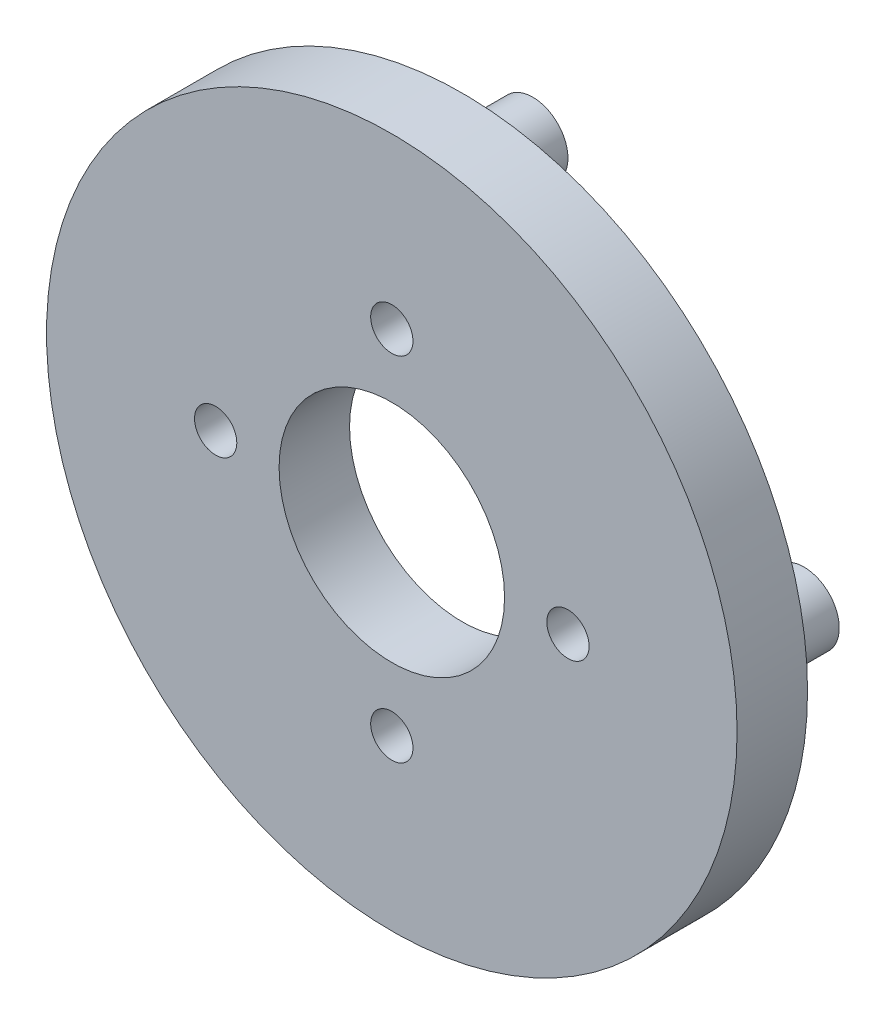
ISO-10303-21;
HEADER;
FILE_DESCRIPTION(('STEP AP214'),'2;1');
FILE_NAME('part.step','',(''),(''),'','','');
FILE_SCHEMA(('AUTOMOTIVE_DESIGN { 1 0 10303 214 1 1 1 1 }'));
ENDSEC;
DATA;
#1=APPLICATION_CONTEXT('core data for automotive mechanical design processes');
#2=APPLICATION_PROTOCOL_DEFINITION('international standard','automotive_design',2000,#1);
#3=PRODUCT_CONTEXT('',#1,'mechanical');
#4=PRODUCT('Part','Part','',(#3));
#5=PRODUCT_RELATED_PRODUCT_CATEGORY('part','',(#4));
#6=PRODUCT_DEFINITION_FORMATION('','',#4);
#7=PRODUCT_DEFINITION_CONTEXT('part definition',#1,'design');
#8=PRODUCT_DEFINITION('design','',#6,#7);
#9=PRODUCT_DEFINITION_SHAPE('','',#8);
#10=(LENGTH_UNIT() NAMED_UNIT(*) SI_UNIT(.MILLI.,.METRE.));
#11=(NAMED_UNIT(*) PLANE_ANGLE_UNIT() SI_UNIT($,.RADIAN.));
#12=(NAMED_UNIT(*) SI_UNIT($,.STERADIAN.) SOLID_ANGLE_UNIT());
#13=UNCERTAINTY_MEASURE_WITH_UNIT(LENGTH_MEASURE(1.E-05),#10,'distance_accuracy_value','');
#14=(GEOMETRIC_REPRESENTATION_CONTEXT(3) GLOBAL_UNCERTAINTY_ASSIGNED_CONTEXT((#13)) GLOBAL_UNIT_ASSIGNED_CONTEXT((#10,
#11,#12)) REPRESENTATION_CONTEXT('',''));
#15=CARTESIAN_POINT('',(0.,0.,0.));
#16=DIRECTION('',(0.,0.,1.));
#17=DIRECTION('',(1.,0.,0.));
#18=AXIS2_PLACEMENT_3D('',#15,#16,#17);
#19=CARTESIAN_POINT('',(0.,0.,5.));
#20=DIRECTION('',(0.,0.,1.));
#21=DIRECTION('',(1.,0.,0.));
#22=AXIS2_PLACEMENT_3D('',#19,#20,#21);
#23=PLANE('',#22);
#24=CARTESIAN_POINT('',(0.,0.,5.));
#25=DIRECTION('',(0.,0.,1.));
#26=DIRECTION('',(1.,0.,0.));
#27=AXIS2_PLACEMENT_3D('',#24,#25,#26);
#28=CIRCLE('',#27,8.);
#29=CARTESIAN_POINT('',(8.,0.,5.));
#30=VERTEX_POINT('',#29);
#31=EDGE_CURVE('E68',#30,#30,#28,.T.);
#32=ORIENTED_EDGE('',*,*,#31,.F.);
#33=EDGE_LOOP('',(#32));
#34=FACE_BOUND('',#33,.T.);
#35=CARTESIAN_POINT('',(7.05950310263298E-13,-12.5,5.));
#36=DIRECTION('',(0.,0.,1.));
#37=DIRECTION('',(1.,0.,0.));
#38=AXIS2_PLACEMENT_3D('',#35,#36,#37);
#39=CIRCLE('',#38,1.50000000000076);
#40=CARTESIAN_POINT('',(1.50000000000146,-12.5,5.));
#41=VERTEX_POINT('',#40);
#42=EDGE_CURVE('E127',#41,#41,#39,.T.);
#43=ORIENTED_EDGE('',*,*,#42,.F.);
#44=EDGE_LOOP('',(#43));
#45=FACE_BOUND('',#44,.T.);
#46=CARTESIAN_POINT('',(0.,12.5,5.));
#47=DIRECTION('',(0.,0.,1.));
#48=DIRECTION('',(1.,0.,0.));
#49=AXIS2_PLACEMENT_3D('',#46,#47,#48);
#50=CIRCLE('',#49,1.5);
#51=CARTESIAN_POINT('',(1.5,12.5,5.));
#52=VERTEX_POINT('',#51);
#53=EDGE_CURVE('E48',#52,#52,#50,.T.);
#54=ORIENTED_EDGE('',*,*,#53,.F.);
#55=EDGE_LOOP('',(#54));
#56=FACE_BOUND('',#55,.T.);
#57=CARTESIAN_POINT('',(0.,0.,5.));
#58=DIRECTION('',(0.,0.,1.));
#59=DIRECTION('',(1.,0.,0.));
#60=AXIS2_PLACEMENT_3D('',#57,#58,#59);
#61=CIRCLE('',#60,24.5);
#62=CARTESIAN_POINT('',(24.5,0.,5.));
#63=VERTEX_POINT('',#62);
#64=EDGE_CURVE('E10',#63,#63,#61,.T.);
#65=ORIENTED_EDGE('',*,*,#64,.T.);
#66=EDGE_LOOP('',(#65));
#67=FACE_BOUND('',#66,.T.);
#68=CARTESIAN_POINT('',(12.5,0.,5.));
#69=DIRECTION('',(0.,0.,1.));
#70=DIRECTION('',(1.,0.,0.));
#71=AXIS2_PLACEMENT_3D('',#68,#69,#70);
#72=CIRCLE('',#71,1.5);
#73=CARTESIAN_POINT('',(14.,0.,5.));
#74=VERTEX_POINT('',#73);
#75=EDGE_CURVE('E129',#74,#74,#72,.T.);
#76=ORIENTED_EDGE('',*,*,#75,.F.);
#77=EDGE_LOOP('',(#76));
#78=FACE_BOUND('',#77,.T.);
#79=CARTESIAN_POINT('',(-12.4999999999996,-3.54505963630583E-13,5.));
#80=DIRECTION('',(0.,0.,1.));
#81=DIRECTION('',(1.,0.,0.));
#82=AXIS2_PLACEMENT_3D('',#79,#80,#81);
#83=CIRCLE('',#82,1.50000000000057);
#84=CARTESIAN_POINT('',(-10.9999999999991,-3.54505963630583E-13,5.));
#85=VERTEX_POINT('',#84);
#86=EDGE_CURVE('E122',#85,#85,#83,.T.);
#87=ORIENTED_EDGE('',*,*,#86,.F.);
#88=EDGE_LOOP('',(#87));
#89=FACE_BOUND('',#88,.T.);
#90=ADVANCED_FACE('F35',(#34,#45,#56,#67,#78,#89),#23,.T.);
#91=CARTESIAN_POINT('',(0.,0.,0.));
#92=DIRECTION('',(0.,0.,1.));
#93=DIRECTION('',(1.,0.,0.));
#94=AXIS2_PLACEMENT_3D('',#91,#92,#93);
#95=PLANE('',#94);
#96=CARTESIAN_POINT('',(0.,12.5,0.));
#97=DIRECTION('',(0.,0.,1.));
#98=DIRECTION('',(1.,0.,0.));
#99=AXIS2_PLACEMENT_3D('',#96,#97,#98);
#100=CIRCLE('',#99,2.5);
#101=CARTESIAN_POINT('',(2.5,12.5,0.));
#102=VERTEX_POINT('',#101);
#103=EDGE_CURVE('E179',#102,#102,#100,.T.);
#104=ORIENTED_EDGE('',*,*,#103,.T.);
#105=EDGE_LOOP('',(#104));
#106=FACE_BOUND('',#105,.T.);
#107=CARTESIAN_POINT('',(12.5000000000004,3.52975155131649E-13,0.));
#108=DIRECTION('',(0.,0.,1.));
#109=DIRECTION('',(1.,0.,0.));
#110=AXIS2_PLACEMENT_3D('',#107,#108,#109);
#111=CIRCLE('',#110,2.50000000000028);
#112=CARTESIAN_POINT('',(15.0000000000006,3.52975155131649E-13,0.));
#113=VERTEX_POINT('',#112);
#114=EDGE_CURVE('E183',#113,#113,#111,.T.);
#115=ORIENTED_EDGE('',*,*,#114,.T.);
#116=EDGE_LOOP('',(#115));
#117=FACE_BOUND('',#116,.T.);
#118=CARTESIAN_POINT('',(7.05950310263298E-13,-12.5,0.));
#119=DIRECTION('',(0.,0.,1.));
#120=DIRECTION('',(1.,0.,0.));
#121=AXIS2_PLACEMENT_3D('',#118,#119,#120);
#122=CIRCLE('',#121,2.50000000000076);
#123=CARTESIAN_POINT('',(2.50000000000147,-12.5,0.));
#124=VERTEX_POINT('',#123);
#125=EDGE_CURVE('E187',#124,#124,#122,.T.);
#126=ORIENTED_EDGE('',*,*,#125,.T.);
#127=EDGE_LOOP('',(#126));
#128=FACE_BOUND('',#127,.T.);
#129=CARTESIAN_POINT('',(-12.4999999999996,-3.54505963630583E-13,0.));
#130=DIRECTION('',(0.,0.,1.));
#131=DIRECTION('',(1.,0.,0.));
#132=AXIS2_PLACEMENT_3D('',#129,#130,#131);
#133=CIRCLE('',#132,2.50000000000057);
#134=CARTESIAN_POINT('',(-9.99999999999908,-3.54505963630583E-13,0.));
#135=VERTEX_POINT('',#134);
#136=EDGE_CURVE('E190',#135,#135,#133,.T.);
#137=ORIENTED_EDGE('',*,*,#136,.T.);
#138=EDGE_LOOP('',(#137));
#139=FACE_BOUND('',#138,.T.);
#140=CARTESIAN_POINT('',(0.,0.,0.));
#141=DIRECTION('',(0.,0.,1.));
#142=DIRECTION('',(1.,0.,0.));
#143=AXIS2_PLACEMENT_3D('',#140,#141,#142);
#144=CIRCLE('',#143,8.);
#145=CARTESIAN_POINT('',(8.,0.,0.));
#146=VERTEX_POINT('',#145);
#147=EDGE_CURVE('E64',#146,#146,#144,.T.);
#148=ORIENTED_EDGE('',*,*,#147,.T.);
#149=EDGE_LOOP('',(#148));
#150=FACE_BOUND('',#149,.T.);
#151=CARTESIAN_POINT('',(-19.2499999999995,-5.45939183991098E-13,0.));
#152=DIRECTION('',(0.,0.,1.));
#153=DIRECTION('',(1.,0.,0.));
#154=AXIS2_PLACEMENT_3D('',#151,#152,#153);
#155=CIRCLE('',#154,2.50000000000087);
#156=CARTESIAN_POINT('',(-16.7499999999986,-5.45939183991098E-13,0.));
#157=VERTEX_POINT('',#156);
#158=EDGE_CURVE('E80',#157,#157,#155,.T.);
#159=ORIENTED_EDGE('',*,*,#158,.T.);
#160=EDGE_LOOP('',(#159));
#161=FACE_BOUND('',#160,.T.);
#162=CARTESIAN_POINT('',(1.08716347780548E-12,-19.25,0.));
#163=DIRECTION('',(0.,0.,1.));
#164=DIRECTION('',(1.,0.,0.));
#165=AXIS2_PLACEMENT_3D('',#162,#163,#164);
#166=CIRCLE('',#165,2.50000000000117);
#167=CARTESIAN_POINT('',(2.50000000000226,-19.25,0.));
#168=VERTEX_POINT('',#167);
#169=EDGE_CURVE('E104',#168,#168,#166,.T.);
#170=ORIENTED_EDGE('',*,*,#169,.T.);
#171=EDGE_LOOP('',(#170));
#172=FACE_BOUND('',#171,.T.);
#173=CARTESIAN_POINT('',(19.2500000000005,5.43581738902739E-13,0.));
#174=DIRECTION('',(0.,0.,1.));
#175=DIRECTION('',(1.,0.,0.));
#176=AXIS2_PLACEMENT_3D('',#173,#174,#175);
#177=CIRCLE('',#176,2.50000000000043);
#178=CARTESIAN_POINT('',(21.750000000001,5.43581738902739E-13,0.));
#179=VERTEX_POINT('',#178);
#180=EDGE_CURVE('E110',#179,#179,#177,.T.);
#181=ORIENTED_EDGE('',*,*,#180,.T.);
#182=EDGE_LOOP('',(#181));
#183=FACE_BOUND('',#182,.T.);
#184=CARTESIAN_POINT('',(0.,19.25,0.));
#185=DIRECTION('',(0.,0.,1.));
#186=DIRECTION('',(1.,0.,0.));
#187=AXIS2_PLACEMENT_3D('',#184,#185,#186);
#188=CIRCLE('',#187,2.5);
#189=CARTESIAN_POINT('',(2.5,19.25,0.));
#190=VERTEX_POINT('',#189);
#191=EDGE_CURVE('E116',#190,#190,#188,.T.);
#192=ORIENTED_EDGE('',*,*,#191,.T.);
#193=EDGE_LOOP('',(#192));
#194=FACE_BOUND('',#193,.T.);
#195=CARTESIAN_POINT('',(0.,0.,0.));
#196=DIRECTION('',(0.,0.,1.));
#197=DIRECTION('',(1.,0.,0.));
#198=AXIS2_PLACEMENT_3D('',#195,#196,#197);
#199=CIRCLE('',#198,24.5);
#200=CARTESIAN_POINT('',(24.5,0.,0.));
#201=VERTEX_POINT('',#200);
#202=EDGE_CURVE('E43',#201,#201,#199,.T.);
#203=ORIENTED_EDGE('',*,*,#202,.F.);
#204=EDGE_LOOP('',(#203));
#205=FACE_BOUND('',#204,.T.);
#206=ADVANCED_FACE('F139',(#106,#117,#128,#139,#150,#161,#172,#183,#194,#205),#95,.F.);
#207=CARTESIAN_POINT('',(0.,0.,5.));
#208=DIRECTION('',(0.,0.,-1.));
#209=DIRECTION('',(-1.,0.,0.));
#210=AXIS2_PLACEMENT_3D('',#207,#208,#209);
#211=CYLINDRICAL_SURFACE('',#210,24.5);
#212=ORIENTED_EDGE('',*,*,#64,.F.);
#213=EDGE_LOOP('',(#212));
#214=FACE_BOUND('',#213,.T.);
#215=ORIENTED_EDGE('',*,*,#202,.T.);
#216=EDGE_LOOP('',(#215));
#217=FACE_BOUND('',#216,.T.);
#218=ADVANCED_FACE('F37',(#214,#217),#211,.T.);
#219=CARTESIAN_POINT('',(0.,12.5,5.));
#220=DIRECTION('',(0.,0.,-1.));
#221=DIRECTION('',(-1.,0.,0.));
#222=AXIS2_PLACEMENT_3D('',#219,#220,#221);
#223=CYLINDRICAL_SURFACE('',#222,1.5);
#224=CARTESIAN_POINT('',(0.,12.5,2.));
#225=DIRECTION('',(0.,0.,1.));
#226=DIRECTION('',(1.,0.,0.));
#227=AXIS2_PLACEMENT_3D('',#224,#225,#226);
#228=CIRCLE('',#227,1.5);
#229=CARTESIAN_POINT('',(1.5,12.5,2.));
#230=VERTEX_POINT('',#229);
#231=EDGE_CURVE('E39',#230,#230,#228,.T.);
#232=ORIENTED_EDGE('',*,*,#231,.F.);
#233=EDGE_LOOP('',(#232));
#234=FACE_BOUND('',#233,.T.);
#235=ORIENTED_EDGE('',*,*,#53,.T.);
#236=EDGE_LOOP('',(#235));
#237=FACE_BOUND('',#236,.T.);
#238=ADVANCED_FACE('F136',(#234,#237),#223,.F.);
#239=CARTESIAN_POINT('',(12.5,0.,5.));
#240=DIRECTION('',(0.,0.,-1.));
#241=DIRECTION('',(-1.,0.,0.));
#242=AXIS2_PLACEMENT_3D('',#239,#240,#241);
#243=CYLINDRICAL_SURFACE('',#242,1.5);
#244=CARTESIAN_POINT('',(12.5,0.,2.));
#245=DIRECTION('',(0.,0.,1.));
#246=DIRECTION('',(1.,0.,0.));
#247=AXIS2_PLACEMENT_3D('',#244,#245,#246);
#248=CIRCLE('',#247,1.5);
#249=CARTESIAN_POINT('',(14.,0.,2.));
#250=VERTEX_POINT('',#249);
#251=EDGE_CURVE('E59',#250,#250,#248,.T.);
#252=ORIENTED_EDGE('',*,*,#251,.F.);
#253=EDGE_LOOP('',(#252));
#254=FACE_BOUND('',#253,.T.);
#255=ORIENTED_EDGE('',*,*,#75,.T.);
#256=EDGE_LOOP('',(#255));
#257=FACE_BOUND('',#256,.T.);
#258=ADVANCED_FACE('F159',(#254,#257),#243,.F.);
#259=CARTESIAN_POINT('',(7.05950310263298E-13,-12.5,5.));
#260=DIRECTION('',(0.,0.,-1.));
#261=DIRECTION('',(-1.,0.,0.));
#262=AXIS2_PLACEMENT_3D('',#259,#260,#261);
#263=CYLINDRICAL_SURFACE('',#262,1.50000000000076);
#264=CARTESIAN_POINT('',(7.05950310263298E-13,-12.5,2.));
#265=DIRECTION('',(0.,0.,1.));
#266=DIRECTION('',(1.,0.,0.));
#267=AXIS2_PLACEMENT_3D('',#264,#265,#266);
#268=CIRCLE('',#267,1.50000000000076);
#269=CARTESIAN_POINT('',(1.50000000000146,-12.5,2.));
#270=VERTEX_POINT('',#269);
#271=EDGE_CURVE('E56',#270,#270,#268,.T.);
#272=ORIENTED_EDGE('',*,*,#271,.F.);
#273=EDGE_LOOP('',(#272));
#274=FACE_BOUND('',#273,.T.);
#275=ORIENTED_EDGE('',*,*,#42,.T.);
#276=EDGE_LOOP('',(#275));
#277=FACE_BOUND('',#276,.T.);
#278=ADVANCED_FACE('F149',(#274,#277),#263,.F.);
#279=CARTESIAN_POINT('',(-12.4999999999996,-3.54505963630583E-13,5.));
#280=DIRECTION('',(0.,0.,-1.));
#281=DIRECTION('',(-1.,0.,0.));
#282=AXIS2_PLACEMENT_3D('',#279,#280,#281);
#283=CYLINDRICAL_SURFACE('',#282,1.50000000000057);
#284=CARTESIAN_POINT('',(-12.4999999999996,-3.54505963630583E-13,2.));
#285=DIRECTION('',(0.,0.,1.));
#286=DIRECTION('',(1.,0.,0.));
#287=AXIS2_PLACEMENT_3D('',#284,#285,#286);
#288=CIRCLE('',#287,1.50000000000057);
#289=CARTESIAN_POINT('',(-10.9999999999991,-3.54505963630583E-13,2.));
#290=VERTEX_POINT('',#289);
#291=EDGE_CURVE('E53',#290,#290,#288,.T.);
#292=ORIENTED_EDGE('',*,*,#291,.F.);
#293=EDGE_LOOP('',(#292));
#294=FACE_BOUND('',#293,.T.);
#295=ORIENTED_EDGE('',*,*,#86,.T.);
#296=EDGE_LOOP('',(#295));
#297=FACE_BOUND('',#296,.T.);
#298=ADVANCED_FACE('F146',(#294,#297),#283,.F.);
#299=CARTESIAN_POINT('',(0.,19.25,-5.));
#300=DIRECTION('',(0.,0.,1.));
#301=DIRECTION('',(1.,0.,0.));
#302=AXIS2_PLACEMENT_3D('',#299,#300,#301);
#303=CYLINDRICAL_SURFACE('',#302,2.5);
#304=CARTESIAN_POINT('',(0.,19.25,-5.));
#305=DIRECTION('',(0.,0.,1.));
#306=DIRECTION('',(1.,0.,0.));
#307=AXIS2_PLACEMENT_3D('',#304,#305,#306);
#308=CIRCLE('',#307,2.5);
#309=CARTESIAN_POINT('',(2.5,19.25,-5.));
#310=VERTEX_POINT('',#309);
#311=EDGE_CURVE('E119',#310,#310,#308,.T.);
#312=ORIENTED_EDGE('',*,*,#311,.T.);
#313=EDGE_LOOP('',(#312));
#314=FACE_BOUND('',#313,.T.);
#315=ORIENTED_EDGE('',*,*,#191,.F.);
#316=EDGE_LOOP('',(#315));
#317=FACE_BOUND('',#316,.T.);
#318=ADVANCED_FACE('F148',(#314,#317),#303,.T.);
#319=CARTESIAN_POINT('',(0.,19.25,-5.));
#320=DIRECTION('',(0.,0.,1.));
#321=DIRECTION('',(1.,0.,0.));
#322=AXIS2_PLACEMENT_3D('',#319,#320,#321);
#323=PLANE('',#322);
#324=CARTESIAN_POINT('',(0.,19.25,-5.));
#325=DIRECTION('',(0.,0.,1.));
#326=DIRECTION('',(1.,0.,0.));
#327=AXIS2_PLACEMENT_3D('',#324,#325,#326);
#328=CIRCLE('',#327,1.25);
#329=CARTESIAN_POINT('',(1.25,19.25,-5.));
#330=VERTEX_POINT('',#329);
#331=EDGE_CURVE('E77',#330,#330,#328,.T.);
#332=ORIENTED_EDGE('',*,*,#331,.T.);
#333=EDGE_LOOP('',(#332));
#334=FACE_BOUND('',#333,.T.);
#335=ORIENTED_EDGE('',*,*,#311,.F.);
#336=EDGE_LOOP('',(#335));
#337=FACE_BOUND('',#336,.T.);
#338=ADVANCED_FACE('F156',(#334,#337),#323,.F.);
#339=CARTESIAN_POINT('',(19.2500000000005,5.43581738902739E-13,-5.));
#340=DIRECTION('',(0.,0.,1.));
#341=DIRECTION('',(1.,0.,0.));
#342=AXIS2_PLACEMENT_3D('',#339,#340,#341);
#343=CYLINDRICAL_SURFACE('',#342,2.50000000000043);
#344=CARTESIAN_POINT('',(19.2500000000005,5.43581738902739E-13,-5.));
#345=DIRECTION('',(0.,0.,1.));
#346=DIRECTION('',(1.,0.,0.));
#347=AXIS2_PLACEMENT_3D('',#344,#345,#346);
#348=CIRCLE('',#347,2.50000000000043);
#349=CARTESIAN_POINT('',(21.750000000001,5.43581738902739E-13,-5.));
#350=VERTEX_POINT('',#349);
#351=EDGE_CURVE('E113',#350,#350,#348,.T.);
#352=ORIENTED_EDGE('',*,*,#351,.T.);
#353=EDGE_LOOP('',(#352));
#354=FACE_BOUND('',#353,.T.);
#355=ORIENTED_EDGE('',*,*,#180,.F.);
#356=EDGE_LOOP('',(#355));
#357=FACE_BOUND('',#356,.T.);
#358=ADVANCED_FACE('F204',(#354,#357),#343,.T.);
#359=CARTESIAN_POINT('',(19.2500000000005,5.43581738902739E-13,-5.));
#360=DIRECTION('',(0.,0.,1.));
#361=DIRECTION('',(1.,0.,0.));
#362=AXIS2_PLACEMENT_3D('',#359,#360,#361);
#363=PLANE('',#362);
#364=CARTESIAN_POINT('',(19.2500000000005,5.43581738902739E-13,-5.));
#365=DIRECTION('',(0.,0.,1.));
#366=DIRECTION('',(1.,0.,0.));
#367=AXIS2_PLACEMENT_3D('',#364,#365,#366);
#368=CIRCLE('',#367,1.25000000000043);
#369=CARTESIAN_POINT('',(20.500000000001,5.43581738902739E-13,-5.));
#370=VERTEX_POINT('',#369);
#371=EDGE_CURVE('E84',#370,#370,#368,.T.);
#372=ORIENTED_EDGE('',*,*,#371,.T.);
#373=EDGE_LOOP('',(#372));
#374=FACE_BOUND('',#373,.T.);
#375=ORIENTED_EDGE('',*,*,#351,.F.);
#376=EDGE_LOOP('',(#375));
#377=FACE_BOUND('',#376,.T.);
#378=ADVANCED_FACE('F206',(#374,#377),#363,.F.);
#379=CARTESIAN_POINT('',(1.08716347780548E-12,-19.25,-5.));
#380=DIRECTION('',(0.,0.,1.));
#381=DIRECTION('',(1.,0.,0.));
#382=AXIS2_PLACEMENT_3D('',#379,#380,#381);
#383=CYLINDRICAL_SURFACE('',#382,2.50000000000117);
#384=CARTESIAN_POINT('',(1.08716347780548E-12,-19.25,-5.));
#385=DIRECTION('',(0.,0.,1.));
#386=DIRECTION('',(1.,0.,0.));
#387=AXIS2_PLACEMENT_3D('',#384,#385,#386);
#388=CIRCLE('',#387,2.50000000000117);
#389=CARTESIAN_POINT('',(2.50000000000226,-19.25,-5.));
#390=VERTEX_POINT('',#389);
#391=EDGE_CURVE('E107',#390,#390,#388,.T.);
#392=ORIENTED_EDGE('',*,*,#391,.T.);
#393=EDGE_LOOP('',(#392));
#394=FACE_BOUND('',#393,.T.);
#395=ORIENTED_EDGE('',*,*,#169,.F.);
#396=EDGE_LOOP('',(#395));
#397=FACE_BOUND('',#396,.T.);
#398=ADVANCED_FACE('F213',(#394,#397),#383,.T.);
#399=CARTESIAN_POINT('',(1.08716347780548E-12,-19.25,-5.));
#400=DIRECTION('',(0.,0.,1.));
#401=DIRECTION('',(1.,0.,0.));
#402=AXIS2_PLACEMENT_3D('',#399,#400,#401);
#403=PLANE('',#402);
#404=CARTESIAN_POINT('',(1.08716347780548E-12,-19.25,-5.));
#405=DIRECTION('',(0.,0.,1.));
#406=DIRECTION('',(1.,0.,0.));
#407=AXIS2_PLACEMENT_3D('',#404,#405,#406);
#408=CIRCLE('',#407,1.25000000000117);
#409=CARTESIAN_POINT('',(1.25000000000226,-19.25,-5.));
#410=VERTEX_POINT('',#409);
#411=EDGE_CURVE('E90',#410,#410,#408,.T.);
#412=ORIENTED_EDGE('',*,*,#411,.T.);
#413=EDGE_LOOP('',(#412));
#414=FACE_BOUND('',#413,.T.);
#415=ORIENTED_EDGE('',*,*,#391,.F.);
#416=EDGE_LOOP('',(#415));
#417=FACE_BOUND('',#416,.T.);
#418=ADVANCED_FACE('F220',(#414,#417),#403,.F.);
#419=CARTESIAN_POINT('',(-19.2499999999995,-5.45939183991098E-13,-5.));
#420=DIRECTION('',(0.,0.,1.));
#421=DIRECTION('',(1.,0.,0.));
#422=AXIS2_PLACEMENT_3D('',#419,#420,#421);
#423=CYLINDRICAL_SURFACE('',#422,2.50000000000087);
#424=CARTESIAN_POINT('',(-19.2499999999995,-5.45939183991098E-13,-5.));
#425=DIRECTION('',(0.,0.,1.));
#426=DIRECTION('',(1.,0.,0.));
#427=AXIS2_PLACEMENT_3D('',#424,#425,#426);
#428=CIRCLE('',#427,2.50000000000087);
#429=CARTESIAN_POINT('',(-16.7499999999986,-5.45939183991098E-13,-5.));
#430=VERTEX_POINT('',#429);
#431=EDGE_CURVE('E101',#430,#430,#428,.T.);
#432=ORIENTED_EDGE('',*,*,#431,.T.);
#433=EDGE_LOOP('',(#432));
#434=FACE_BOUND('',#433,.T.);
#435=ORIENTED_EDGE('',*,*,#158,.F.);
#436=EDGE_LOOP('',(#435));
#437=FACE_BOUND('',#436,.T.);
#438=ADVANCED_FACE('F224',(#434,#437),#423,.T.);
#439=CARTESIAN_POINT('',(-19.2499999999995,-5.45939183991098E-13,-5.));
#440=DIRECTION('',(0.,0.,1.));
#441=DIRECTION('',(1.,0.,0.));
#442=AXIS2_PLACEMENT_3D('',#439,#440,#441);
#443=PLANE('',#442);
#444=CARTESIAN_POINT('',(-19.2499999999995,-5.45939183991098E-13,-5.));
#445=DIRECTION('',(0.,0.,1.));
#446=DIRECTION('',(1.,0.,0.));
#447=AXIS2_PLACEMENT_3D('',#444,#445,#446);
#448=CIRCLE('',#447,1.25000000000087);
#449=CARTESIAN_POINT('',(-17.9999999999986,-5.45939183991098E-13,-5.));
#450=VERTEX_POINT('',#449);
#451=EDGE_CURVE('E96',#450,#450,#448,.T.);
#452=ORIENTED_EDGE('',*,*,#451,.T.);
#453=EDGE_LOOP('',(#452));
#454=FACE_BOUND('',#453,.T.);
#455=ORIENTED_EDGE('',*,*,#431,.F.);
#456=EDGE_LOOP('',(#455));
#457=FACE_BOUND('',#456,.T.);
#458=ADVANCED_FACE('F228',(#454,#457),#443,.F.);
#459=CARTESIAN_POINT('',(-19.2499999999995,-5.45939183991098E-13,-5.));
#460=DIRECTION('',(0.,0.,1.));
#461=DIRECTION('',(1.,0.,0.));
#462=AXIS2_PLACEMENT_3D('',#459,#460,#461);
#463=CYLINDRICAL_SURFACE('',#462,1.25000000000087);
#464=ORIENTED_EDGE('',*,*,#451,.F.);
#465=EDGE_LOOP('',(#464));
#466=FACE_BOUND('',#465,.T.);
#467=CARTESIAN_POINT('',(-19.2499999999995,-5.45939183991098E-13,0.));
#468=DIRECTION('',(0.,0.,1.));
#469=DIRECTION('',(1.,0.,0.));
#470=AXIS2_PLACEMENT_3D('',#467,#468,#469);
#471=CIRCLE('',#470,1.25000000000087);
#472=CARTESIAN_POINT('',(-17.9999999999986,-5.45939183991098E-13,0.));
#473=VERTEX_POINT('',#472);
#474=EDGE_CURVE('E73',#473,#473,#471,.T.);
#475=ORIENTED_EDGE('',*,*,#474,.T.);
#476=EDGE_LOOP('',(#475));
#477=FACE_BOUND('',#476,.T.);
#478=ADVANCED_FACE('F232',(#466,#477),#463,.F.);
#479=CARTESIAN_POINT('',(-19.2499999999995,-5.45939183991098E-13,0.));
#480=DIRECTION('',(0.,0.,1.));
#481=DIRECTION('',(1.,0.,0.));
#482=AXIS2_PLACEMENT_3D('',#479,#480,#481);
#483=PLANE('',#482);
#484=ORIENTED_EDGE('',*,*,#474,.F.);
#485=EDGE_LOOP('',(#484));
#486=FACE_BOUND('',#485,.T.);
#487=ADVANCED_FACE('F236',(#486),#483,.F.);
#488=CARTESIAN_POINT('',(1.08716347780548E-12,-19.25,-5.));
#489=DIRECTION('',(0.,0.,1.));
#490=DIRECTION('',(1.,0.,0.));
#491=AXIS2_PLACEMENT_3D('',#488,#489,#490);
#492=CYLINDRICAL_SURFACE('',#491,1.25000000000117);
#493=ORIENTED_EDGE('',*,*,#411,.F.);
#494=EDGE_LOOP('',(#493));
#495=FACE_BOUND('',#494,.T.);
#496=CARTESIAN_POINT('',(1.08716347780548E-12,-19.25,0.));
#497=DIRECTION('',(0.,0.,1.));
#498=DIRECTION('',(1.,0.,0.));
#499=AXIS2_PLACEMENT_3D('',#496,#497,#498);
#500=CIRCLE('',#499,1.25000000000117);
#501=CARTESIAN_POINT('',(1.25000000000226,-19.25,0.));
#502=VERTEX_POINT('',#501);
#503=EDGE_CURVE('E93',#502,#502,#500,.T.);
#504=ORIENTED_EDGE('',*,*,#503,.T.);
#505=EDGE_LOOP('',(#504));
#506=FACE_BOUND('',#505,.T.);
#507=ADVANCED_FACE('F240',(#495,#506),#492,.F.);
#508=CARTESIAN_POINT('',(1.08716347780548E-12,-19.25,0.));
#509=DIRECTION('',(0.,0.,1.));
#510=DIRECTION('',(1.,0.,0.));
#511=AXIS2_PLACEMENT_3D('',#508,#509,#510);
#512=PLANE('',#511);
#513=ORIENTED_EDGE('',*,*,#503,.F.);
#514=EDGE_LOOP('',(#513));
#515=FACE_BOUND('',#514,.T.);
#516=ADVANCED_FACE('F244',(#515),#512,.F.);
#517=CARTESIAN_POINT('',(19.2500000000005,5.43581738902739E-13,-5.));
#518=DIRECTION('',(0.,0.,1.));
#519=DIRECTION('',(1.,0.,0.));
#520=AXIS2_PLACEMENT_3D('',#517,#518,#519);
#521=CYLINDRICAL_SURFACE('',#520,1.25000000000043);
#522=ORIENTED_EDGE('',*,*,#371,.F.);
#523=EDGE_LOOP('',(#522));
#524=FACE_BOUND('',#523,.T.);
#525=CARTESIAN_POINT('',(19.2500000000005,5.43581738902739E-13,0.));
#526=DIRECTION('',(0.,0.,1.));
#527=DIRECTION('',(1.,0.,0.));
#528=AXIS2_PLACEMENT_3D('',#525,#526,#527);
#529=CIRCLE('',#528,1.25000000000043);
#530=CARTESIAN_POINT('',(20.500000000001,5.43581738902739E-13,0.));
#531=VERTEX_POINT('',#530);
#532=EDGE_CURVE('E87',#531,#531,#529,.T.);
#533=ORIENTED_EDGE('',*,*,#532,.T.);
#534=EDGE_LOOP('',(#533));
#535=FACE_BOUND('',#534,.T.);
#536=ADVANCED_FACE('F248',(#524,#535),#521,.F.);
#537=CARTESIAN_POINT('',(19.2500000000005,5.43581738902739E-13,0.));
#538=DIRECTION('',(0.,0.,1.));
#539=DIRECTION('',(1.,0.,0.));
#540=AXIS2_PLACEMENT_3D('',#537,#538,#539);
#541=PLANE('',#540);
#542=ORIENTED_EDGE('',*,*,#532,.F.);
#543=EDGE_LOOP('',(#542));
#544=FACE_BOUND('',#543,.T.);
#545=ADVANCED_FACE('F252',(#544),#541,.F.);
#546=CARTESIAN_POINT('',(0.,19.25,-5.));
#547=DIRECTION('',(0.,0.,1.));
#548=DIRECTION('',(1.,0.,0.));
#549=AXIS2_PLACEMENT_3D('',#546,#547,#548);
#550=CYLINDRICAL_SURFACE('',#549,1.25);
#551=ORIENTED_EDGE('',*,*,#331,.F.);
#552=EDGE_LOOP('',(#551));
#553=FACE_BOUND('',#552,.T.);
#554=CARTESIAN_POINT('',(0.,19.25,0.));
#555=DIRECTION('',(0.,0.,1.));
#556=DIRECTION('',(1.,0.,0.));
#557=AXIS2_PLACEMENT_3D('',#554,#555,#556);
#558=CIRCLE('',#557,1.25);
#559=CARTESIAN_POINT('',(1.25,19.25,0.));
#560=VERTEX_POINT('',#559);
#561=EDGE_CURVE('E81',#560,#560,#558,.T.);
#562=ORIENTED_EDGE('',*,*,#561,.T.);
#563=EDGE_LOOP('',(#562));
#564=FACE_BOUND('',#563,.T.);
#565=ADVANCED_FACE('F256',(#553,#564),#550,.F.);
#566=CARTESIAN_POINT('',(0.,19.25,0.));
#567=DIRECTION('',(0.,0.,1.));
#568=DIRECTION('',(1.,0.,0.));
#569=AXIS2_PLACEMENT_3D('',#566,#567,#568);
#570=PLANE('',#569);
#571=ORIENTED_EDGE('',*,*,#561,.F.);
#572=EDGE_LOOP('',(#571));
#573=FACE_BOUND('',#572,.T.);
#574=ADVANCED_FACE('F260',(#573),#570,.F.);
#575=CARTESIAN_POINT('',(0.,0.,5.));
#576=DIRECTION('',(0.,0.,-1.));
#577=DIRECTION('',(-1.,0.,0.));
#578=AXIS2_PLACEMENT_3D('',#575,#576,#577);
#579=CYLINDRICAL_SURFACE('',#578,8.);
#580=ORIENTED_EDGE('',*,*,#31,.T.);
#581=EDGE_LOOP('',(#580));
#582=FACE_BOUND('',#581,.T.);
#583=ORIENTED_EDGE('',*,*,#147,.F.);
#584=EDGE_LOOP('',(#583));
#585=FACE_BOUND('',#584,.T.);
#586=ADVANCED_FACE('F264',(#582,#585),#579,.F.);
#587=CARTESIAN_POINT('',(-12.4999999999996,-3.54505963630583E-13,2.));
#588=DIRECTION('',(0.,0.,-1.));
#589=DIRECTION('',(-1.,0.,0.));
#590=AXIS2_PLACEMENT_3D('',#587,#588,#589);
#591=CYLINDRICAL_SURFACE('',#590,2.50000000000057);
#592=CARTESIAN_POINT('',(-12.4999999999996,-3.54505963630583E-13,2.));
#593=DIRECTION('',(0.,0.,1.));
#594=DIRECTION('',(1.,0.,0.));
#595=AXIS2_PLACEMENT_3D('',#592,#593,#594);
#596=CIRCLE('',#595,2.50000000000057);
#597=CARTESIAN_POINT('',(-9.99999999999908,-3.54505963630583E-13,2.));
#598=VERTEX_POINT('',#597);
#599=EDGE_CURVE('E314',#598,#598,#596,.T.);
#600=ORIENTED_EDGE('',*,*,#599,.T.);
#601=EDGE_LOOP('',(#600));
#602=FACE_BOUND('',#601,.T.);
#603=ORIENTED_EDGE('',*,*,#136,.F.);
#604=EDGE_LOOP('',(#603));
#605=FACE_BOUND('',#604,.T.);
#606=ADVANCED_FACE('F268',(#602,#605),#591,.F.);
#607=CARTESIAN_POINT('',(-12.4999999999996,-3.54505963630583E-13,2.));
#608=DIRECTION('',(0.,0.,1.));
#609=DIRECTION('',(1.,0.,0.));
#610=AXIS2_PLACEMENT_3D('',#607,#608,#609);
#611=PLANE('',#610);
#612=ORIENTED_EDGE('',*,*,#291,.T.);
#613=EDGE_LOOP('',(#612));
#614=FACE_BOUND('',#613,.T.);
#615=ORIENTED_EDGE('',*,*,#599,.F.);
#616=EDGE_LOOP('',(#615));
#617=FACE_BOUND('',#616,.T.);
#618=ADVANCED_FACE('F272',(#614,#617),#611,.F.);
#619=CARTESIAN_POINT('',(7.05950310263298E-13,-12.5,2.));
#620=DIRECTION('',(0.,0.,-1.));
#621=DIRECTION('',(-1.,0.,0.));
#622=AXIS2_PLACEMENT_3D('',#619,#620,#621);
#623=CYLINDRICAL_SURFACE('',#622,2.50000000000076);
#624=CARTESIAN_POINT('',(7.05950310263298E-13,-12.5,2.));
#625=DIRECTION('',(0.,0.,1.));
#626=DIRECTION('',(1.,0.,0.));
#627=AXIS2_PLACEMENT_3D('',#624,#625,#626);
#628=CIRCLE('',#627,2.50000000000076);
#629=CARTESIAN_POINT('',(2.50000000000147,-12.5,2.));
#630=VERTEX_POINT('',#629);
#631=EDGE_CURVE('E310',#630,#630,#628,.T.);
#632=ORIENTED_EDGE('',*,*,#631,.T.);
#633=EDGE_LOOP('',(#632));
#634=FACE_BOUND('',#633,.T.);
#635=ORIENTED_EDGE('',*,*,#125,.F.);
#636=EDGE_LOOP('',(#635));
#637=FACE_BOUND('',#636,.T.);
#638=ADVANCED_FACE('F276',(#634,#637),#623,.F.);
#639=CARTESIAN_POINT('',(7.05950310263298E-13,-12.5,2.));
#640=DIRECTION('',(0.,0.,1.));
#641=DIRECTION('',(1.,0.,0.));
#642=AXIS2_PLACEMENT_3D('',#639,#640,#641);
#643=PLANE('',#642);
#644=ORIENTED_EDGE('',*,*,#271,.T.);
#645=EDGE_LOOP('',(#644));
#646=FACE_BOUND('',#645,.T.);
#647=ORIENTED_EDGE('',*,*,#631,.F.);
#648=EDGE_LOOP('',(#647));
#649=FACE_BOUND('',#648,.T.);
#650=ADVANCED_FACE('F280',(#646,#649),#643,.F.);
#651=CARTESIAN_POINT('',(12.5000000000004,3.52975155131649E-13,2.));
#652=DIRECTION('',(0.,0.,-1.));
#653=DIRECTION('',(-1.,0.,0.));
#654=AXIS2_PLACEMENT_3D('',#651,#652,#653);
#655=CYLINDRICAL_SURFACE('',#654,2.50000000000028);
#656=CARTESIAN_POINT('',(12.5000000000004,3.52975155131649E-13,2.));
#657=DIRECTION('',(0.,0.,1.));
#658=DIRECTION('',(1.,0.,0.));
#659=AXIS2_PLACEMENT_3D('',#656,#657,#658);
#660=CIRCLE('',#659,2.50000000000028);
#661=CARTESIAN_POINT('',(15.0000000000006,3.52975155131649E-13,2.));
#662=VERTEX_POINT('',#661);
#663=EDGE_CURVE('E304',#662,#662,#660,.T.);
#664=ORIENTED_EDGE('',*,*,#663,.T.);
#665=EDGE_LOOP('',(#664));
#666=FACE_BOUND('',#665,.T.);
#667=ORIENTED_EDGE('',*,*,#114,.F.);
#668=EDGE_LOOP('',(#667));
#669=FACE_BOUND('',#668,.T.);
#670=ADVANCED_FACE('F284',(#666,#669),#655,.F.);
#671=CARTESIAN_POINT('',(12.5000000000004,3.52975155131649E-13,2.));
#672=DIRECTION('',(0.,0.,1.));
#673=DIRECTION('',(1.,0.,0.));
#674=AXIS2_PLACEMENT_3D('',#671,#672,#673);
#675=PLANE('',#674);
#676=ORIENTED_EDGE('',*,*,#251,.T.);
#677=EDGE_LOOP('',(#676));
#678=FACE_BOUND('',#677,.T.);
#679=ORIENTED_EDGE('',*,*,#663,.F.);
#680=EDGE_LOOP('',(#679));
#681=FACE_BOUND('',#680,.T.);
#682=ADVANCED_FACE('F288',(#678,#681),#675,.F.);
#683=CARTESIAN_POINT('',(0.,12.5,2.));
#684=DIRECTION('',(0.,0.,-1.));
#685=DIRECTION('',(-1.,0.,0.));
#686=AXIS2_PLACEMENT_3D('',#683,#684,#685);
#687=CYLINDRICAL_SURFACE('',#686,2.5);
#688=CARTESIAN_POINT('',(0.,12.5,2.));
#689=DIRECTION('',(0.,0.,1.));
#690=DIRECTION('',(1.,0.,0.));
#691=AXIS2_PLACEMENT_3D('',#688,#689,#690);
#692=CIRCLE('',#691,2.5);
#693=CARTESIAN_POINT('',(2.5,12.5,2.));
#694=VERTEX_POINT('',#693);
#695=EDGE_CURVE('E57',#694,#694,#692,.T.);
#696=ORIENTED_EDGE('',*,*,#695,.T.);
#697=EDGE_LOOP('',(#696));
#698=FACE_BOUND('',#697,.T.);
#699=ORIENTED_EDGE('',*,*,#103,.F.);
#700=EDGE_LOOP('',(#699));
#701=FACE_BOUND('',#700,.T.);
#702=ADVANCED_FACE('F292',(#698,#701),#687,.F.);
#703=CARTESIAN_POINT('',(0.,12.5,2.));
#704=DIRECTION('',(0.,0.,1.));
#705=DIRECTION('',(1.,0.,0.));
#706=AXIS2_PLACEMENT_3D('',#703,#704,#705);
#707=PLANE('',#706);
#708=ORIENTED_EDGE('',*,*,#231,.T.);
#709=EDGE_LOOP('',(#708));
#710=FACE_BOUND('',#709,.T.);
#711=ORIENTED_EDGE('',*,*,#695,.F.);
#712=EDGE_LOOP('',(#711));
#713=FACE_BOUND('',#712,.T.);
#714=ADVANCED_FACE('F295',(#710,#713),#707,.F.);
#715=CLOSED_SHELL('',(#90,#206,#218,#238,#258,#278,#298,#318,#338,#358,#378,#398,#418,#438,#458,
#478,#487,#507,#516,#536,#545,#565,#574,#586,#606,#618,#638,#650,#670,#682,#702,#714));
#716=MANIFOLD_SOLID_BREP('B2',#715);
#717=ADVANCED_BREP_SHAPE_REPRESENTATION('',(#18,#716),#14);
#718=SHAPE_DEFINITION_REPRESENTATION(#9,#717);
ENDSEC;
END-ISO-10303-21;
